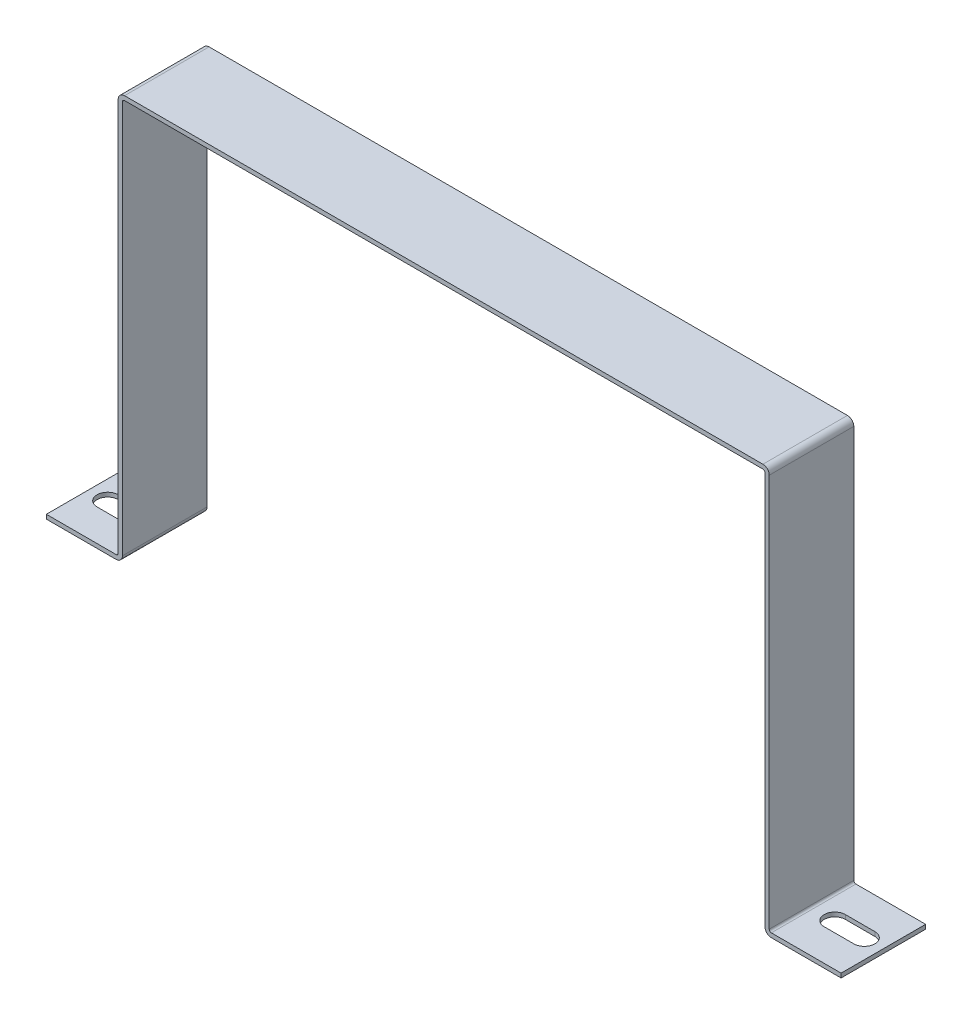
ISO-10303-21;
HEADER;
FILE_DESCRIPTION(('STEP AP214'),'2;1');
FILE_NAME('part.step','',(''),(''),'','','');
FILE_SCHEMA(('AUTOMOTIVE_DESIGN { 1 0 10303 214 1 1 1 1 }'));
ENDSEC;
DATA;
#1=APPLICATION_CONTEXT('core data for automotive mechanical design processes');
#2=APPLICATION_PROTOCOL_DEFINITION('international standard','automotive_design',2000,#1);
#3=PRODUCT_CONTEXT('',#1,'mechanical');
#4=PRODUCT('Part','Part','',(#3));
#5=PRODUCT_RELATED_PRODUCT_CATEGORY('part','',(#4));
#6=PRODUCT_DEFINITION_FORMATION('','',#4);
#7=PRODUCT_DEFINITION_CONTEXT('part definition',#1,'design');
#8=PRODUCT_DEFINITION('design','',#6,#7);
#9=PRODUCT_DEFINITION_SHAPE('','',#8);
#10=(LENGTH_UNIT() NAMED_UNIT(*) SI_UNIT(.MILLI.,.METRE.));
#11=(NAMED_UNIT(*) PLANE_ANGLE_UNIT() SI_UNIT($,.RADIAN.));
#12=(NAMED_UNIT(*) SI_UNIT($,.STERADIAN.) SOLID_ANGLE_UNIT());
#13=UNCERTAINTY_MEASURE_WITH_UNIT(LENGTH_MEASURE(1.E-05),#10,'distance_accuracy_value','');
#14=(GEOMETRIC_REPRESENTATION_CONTEXT(3) GLOBAL_UNCERTAINTY_ASSIGNED_CONTEXT((#13)) GLOBAL_UNIT_ASSIGNED_CONTEXT((#10,
#11,#12)) REPRESENTATION_CONTEXT('',''));
#15=CARTESIAN_POINT('',(0.,0.,0.));
#16=DIRECTION('',(0.,0.,1.));
#17=DIRECTION('',(1.,0.,0.));
#18=AXIS2_PLACEMENT_3D('',#15,#16,#17);
#19=CARTESIAN_POINT('',(-94.,0.999999999999997,20.));
#20=DIRECTION('',(1.,0.,0.));
#21=DIRECTION('',(0.,0.,-1.));
#22=AXIS2_PLACEMENT_3D('',#19,#20,#21);
#23=PLANE('',#22);
#24=DIRECTION('',(0.,-1.,0.));
#25=VECTOR('',#24,1.);
#26=CARTESIAN_POINT('',(-94.,0.999999999999997,0.));
#27=LINE('',#26,#25);
#28=CARTESIAN_POINT('',(-94.,0.999999999999997,0.));
#29=VERTEX_POINT('',#28);
#30=CARTESIAN_POINT('',(-94.,0.,0.));
#31=VERTEX_POINT('',#30);
#32=EDGE_CURVE('E262',#29,#31,#27,.T.);
#33=ORIENTED_EDGE('',*,*,#32,.T.);
#34=DIRECTION('',(0.,0.,-1.));
#35=VECTOR('',#34,1.);
#36=CARTESIAN_POINT('',(-94.,0.,20.));
#37=LINE('',#36,#35);
#38=CARTESIAN_POINT('',(-94.,0.,20.));
#39=VERTEX_POINT('',#38);
#40=EDGE_CURVE('E409',#39,#31,#37,.T.);
#41=ORIENTED_EDGE('',*,*,#40,.F.);
#42=DIRECTION('',(0.,-1.,0.));
#43=VECTOR('',#42,1.);
#44=CARTESIAN_POINT('',(-94.,0.999999999999997,20.));
#45=LINE('',#44,#43);
#46=CARTESIAN_POINT('',(-94.,0.999999999999997,20.));
#47=VERTEX_POINT('',#46);
#48=EDGE_CURVE('E310',#47,#39,#45,.T.);
#49=ORIENTED_EDGE('',*,*,#48,.F.);
#50=DIRECTION('',(0.,0.,-1.));
#51=VECTOR('',#50,1.);
#52=CARTESIAN_POINT('',(-94.,0.999999999999997,20.));
#53=LINE('',#52,#51);
#54=EDGE_CURVE('E351',#47,#29,#53,.T.);
#55=ORIENTED_EDGE('',*,*,#54,.T.);
#56=EDGE_LOOP('',(#33,#41,#49,#55));
#57=FACE_BOUND('',#56,.T.);
#58=ADVANCED_FACE('F36',(#57),#23,.F.);
#59=CARTESIAN_POINT('',(-77.5,0.,20.));
#60=DIRECTION('',(0.,1.,0.));
#61=DIRECTION('',(-1.,0.,0.));
#62=AXIS2_PLACEMENT_3D('',#59,#60,#61);
#63=PLANE('',#62);
#64=DIRECTION('',(1.,0.,0.));
#65=VECTOR('',#64,1.);
#66=CARTESIAN_POINT('',(-89.5,0.,7.5));
#67=LINE('',#66,#65);
#68=CARTESIAN_POINT('',(-89.5,0.,7.5));
#69=VERTEX_POINT('',#68);
#70=CARTESIAN_POINT('',(-82.5,0.,7.5));
#71=VERTEX_POINT('',#70);
#72=EDGE_CURVE('E250',#69,#71,#67,.T.);
#73=ORIENTED_EDGE('',*,*,#72,.F.);
#74=CARTESIAN_POINT('',(-89.5,0.,10.));
#75=DIRECTION('',(0.,-1.,0.));
#76=DIRECTION('',(1.,0.,0.));
#77=AXIS2_PLACEMENT_3D('',#74,#75,#76);
#78=CIRCLE('',#77,2.5);
#79=CARTESIAN_POINT('',(-89.5,0.,12.5));
#80=VERTEX_POINT('',#79);
#81=EDGE_CURVE('E246',#80,#69,#78,.T.);
#82=ORIENTED_EDGE('',*,*,#81,.F.);
#83=DIRECTION('',(-1.,0.,0.));
#84=VECTOR('',#83,1.);
#85=CARTESIAN_POINT('',(-89.5,0.,12.5));
#86=LINE('',#85,#84);
#87=CARTESIAN_POINT('',(-82.5,0.,12.5));
#88=VERTEX_POINT('',#87);
#89=EDGE_CURVE('E256',#88,#80,#86,.T.);
#90=ORIENTED_EDGE('',*,*,#89,.F.);
#91=CARTESIAN_POINT('',(-82.5,0.,10.));
#92=DIRECTION('',(0.,-1.,0.));
#93=DIRECTION('',(1.,0.,0.));
#94=AXIS2_PLACEMENT_3D('',#91,#92,#93);
#95=CIRCLE('',#94,2.5);
#96=EDGE_CURVE('E253',#71,#88,#95,.T.);
#97=ORIENTED_EDGE('',*,*,#96,.F.);
#98=EDGE_LOOP('',(#73,#82,#90,#97));
#99=FACE_BOUND('',#98,.T.);
#100=DIRECTION('',(1.,0.,0.));
#101=VECTOR('',#100,1.);
#102=CARTESIAN_POINT('',(-77.5,0.,0.));
#103=LINE('',#102,#101);
#104=CARTESIAN_POINT('',(-77.5,0.,0.));
#105=VERTEX_POINT('',#104);
#106=EDGE_CURVE('E271',#31,#105,#103,.T.);
#107=ORIENTED_EDGE('',*,*,#106,.T.);
#108=DIRECTION('',(0.,0.,-1.));
#109=VECTOR('',#108,1.);
#110=CARTESIAN_POINT('',(-77.5,0.,20.));
#111=LINE('',#110,#109);
#112=CARTESIAN_POINT('',(-77.5,0.,20.));
#113=VERTEX_POINT('',#112);
#114=EDGE_CURVE('E406',#113,#105,#111,.T.);
#115=ORIENTED_EDGE('',*,*,#114,.F.);
#116=DIRECTION('',(1.,0.,0.));
#117=VECTOR('',#116,1.);
#118=CARTESIAN_POINT('',(-77.5,0.,20.));
#119=LINE('',#118,#117);
#120=EDGE_CURVE('E313',#39,#113,#119,.T.);
#121=ORIENTED_EDGE('',*,*,#120,.F.);
#122=ORIENTED_EDGE('',*,*,#40,.T.);
#123=EDGE_LOOP('',(#107,#115,#121,#122));
#124=FACE_BOUND('',#123,.T.);
#125=ADVANCED_FACE('F448',(#99,#124),#63,.F.);
#126=CARTESIAN_POINT('',(-77.5,1.5,20.));
#127=DIRECTION('',(0.,0.,-1.));
#128=DIRECTION('',(-1.,0.,0.));
#129=AXIS2_PLACEMENT_3D('',#126,#127,#128);
#130=CYLINDRICAL_SURFACE('',#129,1.5);
#131=CARTESIAN_POINT('',(-77.5,1.5,0.));
#132=DIRECTION('',(0.,0.,1.));
#133=DIRECTION('',(-1.,0.,0.));
#134=AXIS2_PLACEMENT_3D('',#131,#132,#133);
#135=CIRCLE('',#134,1.5);
#136=CARTESIAN_POINT('',(-76.,1.50000000000001,0.));
#137=VERTEX_POINT('',#136);
#138=EDGE_CURVE('E273',#105,#137,#135,.T.);
#139=ORIENTED_EDGE('',*,*,#138,.T.);
#140=DIRECTION('',(0.,0.,-1.));
#141=VECTOR('',#140,1.);
#142=CARTESIAN_POINT('',(-76.,1.50000000000001,20.));
#143=LINE('',#142,#141);
#144=CARTESIAN_POINT('',(-76.,1.50000000000001,20.));
#145=VERTEX_POINT('',#144);
#146=EDGE_CURVE('E403',#145,#137,#143,.T.);
#147=ORIENTED_EDGE('',*,*,#146,.F.);
#148=CARTESIAN_POINT('',(-77.5,1.5,20.));
#149=DIRECTION('',(0.,0.,1.));
#150=DIRECTION('',(-1.,0.,0.));
#151=AXIS2_PLACEMENT_3D('',#148,#149,#150);
#152=CIRCLE('',#151,1.5);
#153=EDGE_CURVE('E315',#113,#145,#152,.T.);
#154=ORIENTED_EDGE('',*,*,#153,.F.);
#155=ORIENTED_EDGE('',*,*,#114,.T.);
#156=EDGE_LOOP('',(#139,#147,#154,#155));
#157=FACE_BOUND('',#156,.T.);
#158=ADVANCED_FACE('F453',(#157),#130,.T.);
#159=CARTESIAN_POINT('',(-76.,94.5,20.));
#160=DIRECTION('',(-1.,0.,0.));
#161=DIRECTION('',(0.,-1.,0.));
#162=AXIS2_PLACEMENT_3D('',#159,#160,#161);
#163=PLANE('',#162);
#164=DIRECTION('',(0.,1.,0.));
#165=VECTOR('',#164,1.);
#166=CARTESIAN_POINT('',(-76.,94.5,0.));
#167=LINE('',#166,#165);
#168=CARTESIAN_POINT('',(-76.,94.5,0.));
#169=VERTEX_POINT('',#168);
#170=EDGE_CURVE('E275',#137,#169,#167,.T.);
#171=ORIENTED_EDGE('',*,*,#170,.T.);
#172=DIRECTION('',(0.,0.,-1.));
#173=VECTOR('',#172,1.);
#174=CARTESIAN_POINT('',(-76.,94.5,20.));
#175=LINE('',#174,#173);
#176=CARTESIAN_POINT('',(-76.,94.5,20.));
#177=VERTEX_POINT('',#176);
#178=EDGE_CURVE('E400',#177,#169,#175,.T.);
#179=ORIENTED_EDGE('',*,*,#178,.F.);
#180=DIRECTION('',(0.,1.,0.));
#181=VECTOR('',#180,1.);
#182=CARTESIAN_POINT('',(-76.,94.5,20.));
#183=LINE('',#182,#181);
#184=EDGE_CURVE('E317',#145,#177,#183,.T.);
#185=ORIENTED_EDGE('',*,*,#184,.F.);
#186=ORIENTED_EDGE('',*,*,#146,.T.);
#187=EDGE_LOOP('',(#171,#179,#185,#186));
#188=FACE_BOUND('',#187,.T.);
#189=ADVANCED_FACE('F546',(#188),#163,.F.);
#190=CARTESIAN_POINT('',(-75.5,94.5,20.));
#191=DIRECTION('',(0.,0.,-1.));
#192=DIRECTION('',(-1.,0.,0.));
#193=AXIS2_PLACEMENT_3D('',#190,#191,#192);
#194=CYLINDRICAL_SURFACE('',#193,0.5);
#195=CARTESIAN_POINT('',(-75.5,94.5,0.));
#196=DIRECTION('',(0.,0.,-1.));
#197=DIRECTION('',(1.,0.,0.));
#198=AXIS2_PLACEMENT_3D('',#195,#196,#197);
#199=CIRCLE('',#198,0.5);
#200=CARTESIAN_POINT('',(-75.5,95.,0.));
#201=VERTEX_POINT('',#200);
#202=EDGE_CURVE('E278',#169,#201,#199,.T.);
#203=ORIENTED_EDGE('',*,*,#202,.T.);
#204=DIRECTION('',(0.,0.,-1.));
#205=VECTOR('',#204,1.);
#206=CARTESIAN_POINT('',(-75.5,95.,20.));
#207=LINE('',#206,#205);
#208=CARTESIAN_POINT('',(-75.5,95.,20.));
#209=VERTEX_POINT('',#208);
#210=EDGE_CURVE('E397',#209,#201,#207,.T.);
#211=ORIENTED_EDGE('',*,*,#210,.F.);
#212=CARTESIAN_POINT('',(-75.5,94.5,20.));
#213=DIRECTION('',(0.,0.,-1.));
#214=DIRECTION('',(1.,0.,0.));
#215=AXIS2_PLACEMENT_3D('',#212,#213,#214);
#216=CIRCLE('',#215,0.5);
#217=EDGE_CURVE('E319',#177,#209,#216,.T.);
#218=ORIENTED_EDGE('',*,*,#217,.F.);
#219=ORIENTED_EDGE('',*,*,#178,.T.);
#220=EDGE_LOOP('',(#203,#211,#218,#219));
#221=FACE_BOUND('',#220,.T.);
#222=ADVANCED_FACE('F542',(#221),#194,.F.);
#223=CARTESIAN_POINT('',(75.5,95.,20.));
#224=DIRECTION('',(0.,1.,0.));
#225=DIRECTION('',(0.,0.,1.));
#226=AXIS2_PLACEMENT_3D('',#223,#224,#225);
#227=PLANE('',#226);
#228=DIRECTION('',(1.,0.,0.));
#229=VECTOR('',#228,1.);
#230=CARTESIAN_POINT('',(75.5,95.,0.));
#231=LINE('',#230,#229);
#232=CARTESIAN_POINT('',(75.5,95.,0.));
#233=VERTEX_POINT('',#232);
#234=EDGE_CURVE('E280',#201,#233,#231,.T.);
#235=ORIENTED_EDGE('',*,*,#234,.T.);
#236=DIRECTION('',(0.,0.,-1.));
#237=VECTOR('',#236,1.);
#238=CARTESIAN_POINT('',(75.5,95.,20.));
#239=LINE('',#238,#237);
#240=CARTESIAN_POINT('',(75.5,95.,20.));
#241=VERTEX_POINT('',#240);
#242=EDGE_CURVE('E394',#241,#233,#239,.T.);
#243=ORIENTED_EDGE('',*,*,#242,.F.);
#244=DIRECTION('',(1.,0.,0.));
#245=VECTOR('',#244,1.);
#246=CARTESIAN_POINT('',(75.5,95.,20.));
#247=LINE('',#246,#245);
#248=EDGE_CURVE('E321',#209,#241,#247,.T.);
#249=ORIENTED_EDGE('',*,*,#248,.F.);
#250=ORIENTED_EDGE('',*,*,#210,.T.);
#251=EDGE_LOOP('',(#235,#243,#249,#250));
#252=FACE_BOUND('',#251,.T.);
#253=ADVANCED_FACE('F537',(#252),#227,.F.);
#254=CARTESIAN_POINT('',(75.5,94.5,20.));
#255=DIRECTION('',(0.,0.,-1.));
#256=DIRECTION('',(-1.,0.,0.));
#257=AXIS2_PLACEMENT_3D('',#254,#255,#256);
#258=CYLINDRICAL_SURFACE('',#257,0.499999999999987);
#259=CARTESIAN_POINT('',(75.5,94.5,0.));
#260=DIRECTION('',(0.,0.,-1.));
#261=DIRECTION('',(-1.,0.,0.));
#262=AXIS2_PLACEMENT_3D('',#259,#260,#261);
#263=CIRCLE('',#262,0.499999999999987);
#264=CARTESIAN_POINT('',(76.,94.5,0.));
#265=VERTEX_POINT('',#264);
#266=EDGE_CURVE('E282',#233,#265,#263,.T.);
#267=ORIENTED_EDGE('',*,*,#266,.T.);
#268=DIRECTION('',(0.,0.,-1.));
#269=VECTOR('',#268,1.);
#270=CARTESIAN_POINT('',(76.,94.5,20.));
#271=LINE('',#270,#269);
#272=CARTESIAN_POINT('',(76.,94.5,20.));
#273=VERTEX_POINT('',#272);
#274=EDGE_CURVE('E391',#273,#265,#271,.T.);
#275=ORIENTED_EDGE('',*,*,#274,.F.);
#276=CARTESIAN_POINT('',(75.5,94.5,20.));
#277=DIRECTION('',(0.,0.,-1.));
#278=DIRECTION('',(-1.,0.,0.));
#279=AXIS2_PLACEMENT_3D('',#276,#277,#278);
#280=CIRCLE('',#279,0.499999999999987);
#281=EDGE_CURVE('E323',#241,#273,#280,.T.);
#282=ORIENTED_EDGE('',*,*,#281,.F.);
#283=ORIENTED_EDGE('',*,*,#242,.T.);
#284=EDGE_LOOP('',(#267,#275,#282,#283));
#285=FACE_BOUND('',#284,.T.);
#286=ADVANCED_FACE('F532',(#285),#258,.F.);
#287=CARTESIAN_POINT('',(76.,94.5,20.));
#288=DIRECTION('',(1.,0.,0.));
#289=DIRECTION('',(0.,1.,0.));
#290=AXIS2_PLACEMENT_3D('',#287,#288,#289);
#291=PLANE('',#290);
#292=DIRECTION('',(0.,-1.,0.));
#293=VECTOR('',#292,1.);
#294=CARTESIAN_POINT('',(76.,94.5,0.));
#295=LINE('',#294,#293);
#296=CARTESIAN_POINT('',(76.,1.50000000000001,0.));
#297=VERTEX_POINT('',#296);
#298=EDGE_CURVE('E284',#265,#297,#295,.T.);
#299=ORIENTED_EDGE('',*,*,#298,.T.);
#300=DIRECTION('',(0.,0.,-1.));
#301=VECTOR('',#300,1.);
#302=CARTESIAN_POINT('',(76.,1.50000000000001,20.));
#303=LINE('',#302,#301);
#304=CARTESIAN_POINT('',(76.,1.50000000000001,20.));
#305=VERTEX_POINT('',#304);
#306=EDGE_CURVE('E388',#305,#297,#303,.T.);
#307=ORIENTED_EDGE('',*,*,#306,.F.);
#308=DIRECTION('',(0.,-1.,0.));
#309=VECTOR('',#308,1.);
#310=CARTESIAN_POINT('',(76.,94.5,20.));
#311=LINE('',#310,#309);
#312=EDGE_CURVE('E325',#273,#305,#311,.T.);
#313=ORIENTED_EDGE('',*,*,#312,.F.);
#314=ORIENTED_EDGE('',*,*,#274,.T.);
#315=EDGE_LOOP('',(#299,#307,#313,#314));
#316=FACE_BOUND('',#315,.T.);
#317=ADVANCED_FACE('F528',(#316),#291,.F.);
#318=CARTESIAN_POINT('',(77.5,1.5,20.));
#319=DIRECTION('',(0.,0.,-1.));
#320=DIRECTION('',(-1.,0.,0.));
#321=AXIS2_PLACEMENT_3D('',#318,#319,#320);
#322=CYLINDRICAL_SURFACE('',#321,1.5);
#323=CARTESIAN_POINT('',(77.5,1.5,0.));
#324=DIRECTION('',(0.,0.,1.));
#325=DIRECTION('',(1.,0.,0.));
#326=AXIS2_PLACEMENT_3D('',#323,#324,#325);
#327=CIRCLE('',#326,1.5);
#328=CARTESIAN_POINT('',(77.5,0.,0.));
#329=VERTEX_POINT('',#328);
#330=EDGE_CURVE('E286',#297,#329,#327,.T.);
#331=ORIENTED_EDGE('',*,*,#330,.T.);
#332=DIRECTION('',(0.,0.,-1.));
#333=VECTOR('',#332,1.);
#334=CARTESIAN_POINT('',(77.5,0.,20.));
#335=LINE('',#334,#333);
#336=CARTESIAN_POINT('',(77.5,0.,20.));
#337=VERTEX_POINT('',#336);
#338=EDGE_CURVE('E385',#337,#329,#335,.T.);
#339=ORIENTED_EDGE('',*,*,#338,.F.);
#340=CARTESIAN_POINT('',(77.5,1.5,20.));
#341=DIRECTION('',(0.,0.,1.));
#342=DIRECTION('',(1.,0.,0.));
#343=AXIS2_PLACEMENT_3D('',#340,#341,#342);
#344=CIRCLE('',#343,1.5);
#345=EDGE_CURVE('E327',#305,#337,#344,.T.);
#346=ORIENTED_EDGE('',*,*,#345,.F.);
#347=ORIENTED_EDGE('',*,*,#306,.T.);
#348=EDGE_LOOP('',(#331,#339,#346,#347));
#349=FACE_BOUND('',#348,.T.);
#350=ADVANCED_FACE('F523',(#349),#322,.T.);
#351=CARTESIAN_POINT('',(77.5,0.,20.));
#352=DIRECTION('',(0.,1.,0.));
#353=DIRECTION('',(-1.,0.,0.));
#354=AXIS2_PLACEMENT_3D('',#351,#352,#353);
#355=PLANE('',#354);
#356=DIRECTION('',(1.,0.,0.));
#357=VECTOR('',#356,1.);
#358=CARTESIAN_POINT('',(89.5,0.,7.5));
#359=LINE('',#358,#357);
#360=CARTESIAN_POINT('',(82.5,0.,7.5));
#361=VERTEX_POINT('',#360);
#362=CARTESIAN_POINT('',(89.5,0.,7.5));
#363=VERTEX_POINT('',#362);
#364=EDGE_CURVE('E232',#361,#363,#359,.T.);
#365=ORIENTED_EDGE('',*,*,#364,.F.);
#366=CARTESIAN_POINT('',(82.5,0.,10.));
#367=DIRECTION('',(0.,-1.,0.));
#368=DIRECTION('',(-1.,0.,0.));
#369=AXIS2_PLACEMENT_3D('',#366,#367,#368);
#370=CIRCLE('',#369,2.5);
#371=CARTESIAN_POINT('',(82.5,0.,12.5));
#372=VERTEX_POINT('',#371);
#373=EDGE_CURVE('E50',#372,#361,#370,.T.);
#374=ORIENTED_EDGE('',*,*,#373,.F.);
#375=DIRECTION('',(-1.,0.,0.));
#376=VECTOR('',#375,1.);
#377=CARTESIAN_POINT('',(89.5,0.,12.5));
#378=LINE('',#377,#376);
#379=CARTESIAN_POINT('',(89.5,0.,12.5));
#380=VERTEX_POINT('',#379);
#381=EDGE_CURVE('E239',#380,#372,#378,.T.);
#382=ORIENTED_EDGE('',*,*,#381,.F.);
#383=CARTESIAN_POINT('',(89.5,0.,10.));
#384=DIRECTION('',(0.,-1.,0.));
#385=DIRECTION('',(-1.,0.,0.));
#386=AXIS2_PLACEMENT_3D('',#383,#384,#385);
#387=CIRCLE('',#386,2.5);
#388=EDGE_CURVE('E223',#363,#380,#387,.T.);
#389=ORIENTED_EDGE('',*,*,#388,.F.);
#390=EDGE_LOOP('',(#365,#374,#382,#389));
#391=FACE_BOUND('',#390,.T.);
#392=DIRECTION('',(1.,0.,0.));
#393=VECTOR('',#392,1.);
#394=CARTESIAN_POINT('',(77.5,0.,0.));
#395=LINE('',#394,#393);
#396=CARTESIAN_POINT('',(94.,0.,0.));
#397=VERTEX_POINT('',#396);
#398=EDGE_CURVE('E288',#329,#397,#395,.T.);
#399=ORIENTED_EDGE('',*,*,#398,.T.);
#400=DIRECTION('',(0.,0.,-1.));
#401=VECTOR('',#400,1.);
#402=CARTESIAN_POINT('',(94.,0.,20.));
#403=LINE('',#402,#401);
#404=CARTESIAN_POINT('',(94.,0.,20.));
#405=VERTEX_POINT('',#404);
#406=EDGE_CURVE('E382',#405,#397,#403,.T.);
#407=ORIENTED_EDGE('',*,*,#406,.F.);
#408=DIRECTION('',(1.,0.,0.));
#409=VECTOR('',#408,1.);
#410=CARTESIAN_POINT('',(77.5,0.,20.));
#411=LINE('',#410,#409);
#412=EDGE_CURVE('E329',#337,#405,#411,.T.);
#413=ORIENTED_EDGE('',*,*,#412,.F.);
#414=ORIENTED_EDGE('',*,*,#338,.T.);
#415=EDGE_LOOP('',(#399,#407,#413,#414));
#416=FACE_BOUND('',#415,.T.);
#417=ADVANCED_FACE('F236',(#391,#416),#355,.F.);
#418=CARTESIAN_POINT('',(94.,0.999999999999997,20.));
#419=DIRECTION('',(-1.,0.,0.));
#420=DIRECTION('',(0.,0.,1.));
#421=AXIS2_PLACEMENT_3D('',#418,#419,#420);
#422=PLANE('',#421);
#423=DIRECTION('',(0.,1.,0.));
#424=VECTOR('',#423,1.);
#425=CARTESIAN_POINT('',(94.,0.999999999999997,0.));
#426=LINE('',#425,#424);
#427=CARTESIAN_POINT('',(94.,0.999999999999997,0.));
#428=VERTEX_POINT('',#427);
#429=EDGE_CURVE('E290',#397,#428,#426,.T.);
#430=ORIENTED_EDGE('',*,*,#429,.T.);
#431=DIRECTION('',(0.,0.,-1.));
#432=VECTOR('',#431,1.);
#433=CARTESIAN_POINT('',(94.,0.999999999999997,20.));
#434=LINE('',#433,#432);
#435=CARTESIAN_POINT('',(94.,0.999999999999997,20.));
#436=VERTEX_POINT('',#435);
#437=EDGE_CURVE('E379',#436,#428,#434,.T.);
#438=ORIENTED_EDGE('',*,*,#437,.F.);
#439=DIRECTION('',(0.,1.,0.));
#440=VECTOR('',#439,1.);
#441=CARTESIAN_POINT('',(94.,0.999999999999997,20.));
#442=LINE('',#441,#440);
#443=EDGE_CURVE('E331',#405,#436,#442,.T.);
#444=ORIENTED_EDGE('',*,*,#443,.F.);
#445=ORIENTED_EDGE('',*,*,#406,.T.);
#446=EDGE_LOOP('',(#430,#438,#444,#445));
#447=FACE_BOUND('',#446,.T.);
#448=ADVANCED_FACE('F515',(#447),#422,.F.);
#449=CARTESIAN_POINT('',(77.5,0.999999999999997,20.));
#450=DIRECTION('',(0.,-1.,0.));
#451=DIRECTION('',(0.,0.,-1.));
#452=AXIS2_PLACEMENT_3D('',#449,#450,#451);
#453=PLANE('',#452);
#454=DIRECTION('',(-1.,0.,0.));
#455=VECTOR('',#454,1.);
#456=CARTESIAN_POINT('',(77.5,0.999999999999997,12.5));
#457=LINE('',#456,#455);
#458=CARTESIAN_POINT('',(89.5,1.00000000000003,12.5));
#459=VERTEX_POINT('',#458);
#460=CARTESIAN_POINT('',(82.5,1.00000000000003,12.5));
#461=VERTEX_POINT('',#460);
#462=EDGE_CURVE('E43',#459,#461,#457,.T.);
#463=ORIENTED_EDGE('',*,*,#462,.T.);
#464=CARTESIAN_POINT('',(82.5,1.,10.));
#465=DIRECTION('',(0.,-1.,0.));
#466=DIRECTION('',(0.,0.,-1.));
#467=AXIS2_PLACEMENT_3D('',#464,#465,#466);
#468=CIRCLE('',#467,2.5);
#469=CARTESIAN_POINT('',(82.5,1.00000000000003,7.5));
#470=VERTEX_POINT('',#469);
#471=EDGE_CURVE('E11',#461,#470,#468,.T.);
#472=ORIENTED_EDGE('',*,*,#471,.T.);
#473=DIRECTION('',(1.,0.,0.));
#474=VECTOR('',#473,1.);
#475=CARTESIAN_POINT('',(77.5,0.999999999999997,7.5));
#476=LINE('',#475,#474);
#477=CARTESIAN_POINT('',(89.5,0.999999999999997,7.5));
#478=VERTEX_POINT('',#477);
#479=EDGE_CURVE('E424',#470,#478,#476,.T.);
#480=ORIENTED_EDGE('',*,*,#479,.T.);
#481=CARTESIAN_POINT('',(89.5,1.,10.));
#482=DIRECTION('',(0.,-1.,0.));
#483=DIRECTION('',(0.,0.,-1.));
#484=AXIS2_PLACEMENT_3D('',#481,#482,#483);
#485=CIRCLE('',#484,2.5);
#486=EDGE_CURVE('E226',#478,#459,#485,.T.);
#487=ORIENTED_EDGE('',*,*,#486,.T.);
#488=EDGE_LOOP('',(#463,#472,#480,#487));
#489=FACE_BOUND('',#488,.T.);
#490=DIRECTION('',(-1.,0.,0.));
#491=VECTOR('',#490,1.);
#492=CARTESIAN_POINT('',(77.5,0.999999999999997,0.));
#493=LINE('',#492,#491);
#494=CARTESIAN_POINT('',(77.5,0.999999999999997,0.));
#495=VERTEX_POINT('',#494);
#496=EDGE_CURVE('E292',#428,#495,#493,.T.);
#497=ORIENTED_EDGE('',*,*,#496,.T.);
#498=DIRECTION('',(0.,0.,-1.));
#499=VECTOR('',#498,1.);
#500=CARTESIAN_POINT('',(77.5,0.999999999999997,20.));
#501=LINE('',#500,#499);
#502=CARTESIAN_POINT('',(77.5,0.999999999999997,20.));
#503=VERTEX_POINT('',#502);
#504=EDGE_CURVE('E376',#503,#495,#501,.T.);
#505=ORIENTED_EDGE('',*,*,#504,.F.);
#506=DIRECTION('',(-1.,0.,0.));
#507=VECTOR('',#506,1.);
#508=CARTESIAN_POINT('',(77.5,0.999999999999997,20.));
#509=LINE('',#508,#507);
#510=EDGE_CURVE('E333',#436,#503,#509,.T.);
#511=ORIENTED_EDGE('',*,*,#510,.F.);
#512=ORIENTED_EDGE('',*,*,#437,.T.);
#513=EDGE_LOOP('',(#497,#505,#511,#512));
#514=FACE_BOUND('',#513,.T.);
#515=ADVANCED_FACE('F428',(#489,#514),#453,.F.);
#516=CARTESIAN_POINT('',(77.5,1.5,20.));
#517=DIRECTION('',(0.,0.,-1.));
#518=DIRECTION('',(-1.,0.,0.));
#519=AXIS2_PLACEMENT_3D('',#516,#517,#518);
#520=CYLINDRICAL_SURFACE('',#519,0.499999999999993);
#521=CARTESIAN_POINT('',(77.5,1.5,0.));
#522=DIRECTION('',(0.,0.,-1.));
#523=DIRECTION('',(1.,0.,0.));
#524=AXIS2_PLACEMENT_3D('',#521,#522,#523);
#525=CIRCLE('',#524,0.499999999999993);
#526=CARTESIAN_POINT('',(77.,1.5,0.));
#527=VERTEX_POINT('',#526);
#528=EDGE_CURVE('E294',#495,#527,#525,.T.);
#529=ORIENTED_EDGE('',*,*,#528,.T.);
#530=DIRECTION('',(0.,0.,-1.));
#531=VECTOR('',#530,1.);
#532=CARTESIAN_POINT('',(77.,1.5,20.));
#533=LINE('',#532,#531);
#534=CARTESIAN_POINT('',(77.,1.5,20.));
#535=VERTEX_POINT('',#534);
#536=EDGE_CURVE('E373',#535,#527,#533,.T.);
#537=ORIENTED_EDGE('',*,*,#536,.F.);
#538=CARTESIAN_POINT('',(77.5,1.5,20.));
#539=DIRECTION('',(0.,0.,-1.));
#540=DIRECTION('',(1.,0.,0.));
#541=AXIS2_PLACEMENT_3D('',#538,#539,#540);
#542=CIRCLE('',#541,0.499999999999993);
#543=EDGE_CURVE('E335',#503,#535,#542,.T.);
#544=ORIENTED_EDGE('',*,*,#543,.F.);
#545=ORIENTED_EDGE('',*,*,#504,.T.);
#546=EDGE_LOOP('',(#529,#537,#544,#545));
#547=FACE_BOUND('',#546,.T.);
#548=ADVANCED_FACE('F506',(#547),#520,.F.);
#549=CARTESIAN_POINT('',(77.,94.5,20.));
#550=DIRECTION('',(-1.,0.,0.));
#551=DIRECTION('',(0.,0.,1.));
#552=AXIS2_PLACEMENT_3D('',#549,#550,#551);
#553=PLANE('',#552);
#554=DIRECTION('',(0.,1.,0.));
#555=VECTOR('',#554,1.);
#556=CARTESIAN_POINT('',(77.,94.5,0.));
#557=LINE('',#556,#555);
#558=CARTESIAN_POINT('',(77.,94.5,0.));
#559=VERTEX_POINT('',#558);
#560=EDGE_CURVE('E296',#527,#559,#557,.T.);
#561=ORIENTED_EDGE('',*,*,#560,.T.);
#562=DIRECTION('',(0.,0.,-1.));
#563=VECTOR('',#562,1.);
#564=CARTESIAN_POINT('',(77.,94.5,20.));
#565=LINE('',#564,#563);
#566=CARTESIAN_POINT('',(77.,94.5,20.));
#567=VERTEX_POINT('',#566);
#568=EDGE_CURVE('E370',#567,#559,#565,.T.);
#569=ORIENTED_EDGE('',*,*,#568,.F.);
#570=DIRECTION('',(0.,1.,0.));
#571=VECTOR('',#570,1.);
#572=CARTESIAN_POINT('',(77.,94.5,20.));
#573=LINE('',#572,#571);
#574=EDGE_CURVE('E337',#535,#567,#573,.T.);
#575=ORIENTED_EDGE('',*,*,#574,.F.);
#576=ORIENTED_EDGE('',*,*,#536,.T.);
#577=EDGE_LOOP('',(#561,#569,#575,#576));
#578=FACE_BOUND('',#577,.T.);
#579=ADVANCED_FACE('F502',(#578),#553,.F.);
#580=CARTESIAN_POINT('',(75.5,94.5,20.));
#581=DIRECTION('',(0.,0.,-1.));
#582=DIRECTION('',(-1.,0.,0.));
#583=AXIS2_PLACEMENT_3D('',#580,#581,#582);
#584=CYLINDRICAL_SURFACE('',#583,1.5);
#585=CARTESIAN_POINT('',(75.5,94.5,0.));
#586=DIRECTION('',(0.,0.,1.));
#587=DIRECTION('',(-1.,0.,0.));
#588=AXIS2_PLACEMENT_3D('',#585,#586,#587);
#589=CIRCLE('',#588,1.5);
#590=CARTESIAN_POINT('',(75.5,96.,0.));
#591=VERTEX_POINT('',#590);
#592=EDGE_CURVE('E298',#559,#591,#589,.T.);
#593=ORIENTED_EDGE('',*,*,#592,.T.);
#594=DIRECTION('',(0.,0.,-1.));
#595=VECTOR('',#594,1.);
#596=CARTESIAN_POINT('',(75.5,96.,20.));
#597=LINE('',#596,#595);
#598=CARTESIAN_POINT('',(75.5,96.,20.));
#599=VERTEX_POINT('',#598);
#600=EDGE_CURVE('E367',#599,#591,#597,.T.);
#601=ORIENTED_EDGE('',*,*,#600,.F.);
#602=CARTESIAN_POINT('',(75.5,94.5,20.));
#603=DIRECTION('',(0.,0.,1.));
#604=DIRECTION('',(-1.,0.,0.));
#605=AXIS2_PLACEMENT_3D('',#602,#603,#604);
#606=CIRCLE('',#605,1.5);
#607=EDGE_CURVE('E339',#567,#599,#606,.T.);
#608=ORIENTED_EDGE('',*,*,#607,.F.);
#609=ORIENTED_EDGE('',*,*,#568,.T.);
#610=EDGE_LOOP('',(#593,#601,#608,#609));
#611=FACE_BOUND('',#610,.T.);
#612=ADVANCED_FACE('F497',(#611),#584,.T.);
#613=CARTESIAN_POINT('',(75.5,96.,20.));
#614=DIRECTION('',(0.,-1.,0.));
#615=DIRECTION('',(0.,0.,-1.));
#616=AXIS2_PLACEMENT_3D('',#613,#614,#615);
#617=PLANE('',#616);
#618=DIRECTION('',(-1.,0.,0.));
#619=VECTOR('',#618,1.);
#620=CARTESIAN_POINT('',(75.5,96.,0.));
#621=LINE('',#620,#619);
#622=CARTESIAN_POINT('',(-75.5,96.,0.));
#623=VERTEX_POINT('',#622);
#624=EDGE_CURVE('E300',#591,#623,#621,.T.);
#625=ORIENTED_EDGE('',*,*,#624,.T.);
#626=DIRECTION('',(0.,0.,-1.));
#627=VECTOR('',#626,1.);
#628=CARTESIAN_POINT('',(-75.5,96.,20.));
#629=LINE('',#628,#627);
#630=CARTESIAN_POINT('',(-75.5,96.,20.));
#631=VERTEX_POINT('',#630);
#632=EDGE_CURVE('E364',#631,#623,#629,.T.);
#633=ORIENTED_EDGE('',*,*,#632,.F.);
#634=DIRECTION('',(-1.,0.,0.));
#635=VECTOR('',#634,1.);
#636=CARTESIAN_POINT('',(75.5,96.,20.));
#637=LINE('',#636,#635);
#638=EDGE_CURVE('E341',#599,#631,#637,.T.);
#639=ORIENTED_EDGE('',*,*,#638,.F.);
#640=ORIENTED_EDGE('',*,*,#600,.T.);
#641=EDGE_LOOP('',(#625,#633,#639,#640));
#642=FACE_BOUND('',#641,.T.);
#643=ADVANCED_FACE('F491',(#642),#617,.F.);
#644=CARTESIAN_POINT('',(-75.5,94.5,20.));
#645=DIRECTION('',(0.,0.,-1.));
#646=DIRECTION('',(-1.,0.,0.));
#647=AXIS2_PLACEMENT_3D('',#644,#645,#646);
#648=CYLINDRICAL_SURFACE('',#647,1.5);
#649=CARTESIAN_POINT('',(-75.5,94.5,0.));
#650=DIRECTION('',(0.,0.,1.));
#651=DIRECTION('',(1.,0.,0.));
#652=AXIS2_PLACEMENT_3D('',#649,#650,#651);
#653=CIRCLE('',#652,1.5);
#654=CARTESIAN_POINT('',(-77.,94.5,0.));
#655=VERTEX_POINT('',#654);
#656=EDGE_CURVE('E302',#623,#655,#653,.T.);
#657=ORIENTED_EDGE('',*,*,#656,.T.);
#658=DIRECTION('',(0.,0.,-1.));
#659=VECTOR('',#658,1.);
#660=CARTESIAN_POINT('',(-77.,94.5,20.));
#661=LINE('',#660,#659);
#662=CARTESIAN_POINT('',(-77.,94.5,20.));
#663=VERTEX_POINT('',#662);
#664=EDGE_CURVE('E361',#663,#655,#661,.T.);
#665=ORIENTED_EDGE('',*,*,#664,.F.);
#666=CARTESIAN_POINT('',(-75.5,94.5,20.));
#667=DIRECTION('',(0.,0.,1.));
#668=DIRECTION('',(1.,0.,0.));
#669=AXIS2_PLACEMENT_3D('',#666,#667,#668);
#670=CIRCLE('',#669,1.5);
#671=EDGE_CURVE('E343',#631,#663,#670,.T.);
#672=ORIENTED_EDGE('',*,*,#671,.F.);
#673=ORIENTED_EDGE('',*,*,#632,.T.);
#674=EDGE_LOOP('',(#657,#665,#672,#673));
#675=FACE_BOUND('',#674,.T.);
#676=ADVANCED_FACE('F487',(#675),#648,.T.);
#677=CARTESIAN_POINT('',(-77.,94.5,20.));
#678=DIRECTION('',(1.,0.,0.));
#679=DIRECTION('',(0.,0.,-1.));
#680=AXIS2_PLACEMENT_3D('',#677,#678,#679);
#681=PLANE('',#680);
#682=DIRECTION('',(0.,-1.,0.));
#683=VECTOR('',#682,1.);
#684=CARTESIAN_POINT('',(-77.,94.5,0.));
#685=LINE('',#684,#683);
#686=CARTESIAN_POINT('',(-77.,1.5,0.));
#687=VERTEX_POINT('',#686);
#688=EDGE_CURVE('E304',#655,#687,#685,.T.);
#689=ORIENTED_EDGE('',*,*,#688,.T.);
#690=DIRECTION('',(0.,0.,-1.));
#691=VECTOR('',#690,1.);
#692=CARTESIAN_POINT('',(-77.,1.5,20.));
#693=LINE('',#692,#691);
#694=CARTESIAN_POINT('',(-77.,1.5,20.));
#695=VERTEX_POINT('',#694);
#696=EDGE_CURVE('E358',#695,#687,#693,.T.);
#697=ORIENTED_EDGE('',*,*,#696,.F.);
#698=DIRECTION('',(0.,-1.,0.));
#699=VECTOR('',#698,1.);
#700=CARTESIAN_POINT('',(-77.,94.5,20.));
#701=LINE('',#700,#699);
#702=EDGE_CURVE('E345',#663,#695,#701,.T.);
#703=ORIENTED_EDGE('',*,*,#702,.F.);
#704=ORIENTED_EDGE('',*,*,#664,.T.);
#705=EDGE_LOOP('',(#689,#697,#703,#704));
#706=FACE_BOUND('',#705,.T.);
#707=ADVANCED_FACE('F482',(#706),#681,.F.);
#708=CARTESIAN_POINT('',(-77.5,1.5,20.));
#709=DIRECTION('',(0.,0.,-1.));
#710=DIRECTION('',(-1.,0.,0.));
#711=AXIS2_PLACEMENT_3D('',#708,#709,#710);
#712=CYLINDRICAL_SURFACE('',#711,0.5);
#713=CARTESIAN_POINT('',(-77.5,1.5,0.));
#714=DIRECTION('',(0.,0.,-1.));
#715=DIRECTION('',(-1.,0.,0.));
#716=AXIS2_PLACEMENT_3D('',#713,#714,#715);
#717=CIRCLE('',#716,0.5);
#718=CARTESIAN_POINT('',(-77.5,0.999999999999997,0.));
#719=VERTEX_POINT('',#718);
#720=EDGE_CURVE('E306',#687,#719,#717,.T.);
#721=ORIENTED_EDGE('',*,*,#720,.T.);
#722=DIRECTION('',(0.,0.,-1.));
#723=VECTOR('',#722,1.);
#724=CARTESIAN_POINT('',(-77.5,0.999999999999997,20.));
#725=LINE('',#724,#723);
#726=CARTESIAN_POINT('',(-77.5,0.999999999999997,20.));
#727=VERTEX_POINT('',#726);
#728=EDGE_CURVE('E355',#727,#719,#725,.T.);
#729=ORIENTED_EDGE('',*,*,#728,.F.);
#730=CARTESIAN_POINT('',(-77.5,1.5,20.));
#731=DIRECTION('',(0.,0.,-1.));
#732=DIRECTION('',(-1.,0.,0.));
#733=AXIS2_PLACEMENT_3D('',#730,#731,#732);
#734=CIRCLE('',#733,0.5);
#735=EDGE_CURVE('E347',#695,#727,#734,.T.);
#736=ORIENTED_EDGE('',*,*,#735,.F.);
#737=ORIENTED_EDGE('',*,*,#696,.T.);
#738=EDGE_LOOP('',(#721,#729,#736,#737));
#739=FACE_BOUND('',#738,.T.);
#740=ADVANCED_FACE('F476',(#739),#712,.F.);
#741=CARTESIAN_POINT('',(-77.5,0.999999999999997,20.));
#742=DIRECTION('',(0.,-1.,0.));
#743=DIRECTION('',(0.,0.,-1.));
#744=AXIS2_PLACEMENT_3D('',#741,#742,#743);
#745=PLANE('',#744);
#746=DIRECTION('',(-1.,0.,0.));
#747=VECTOR('',#746,1.);
#748=CARTESIAN_POINT('',(-77.5,0.999999999999997,12.5));
#749=LINE('',#748,#747);
#750=CARTESIAN_POINT('',(-82.5,1.00000000000003,12.5));
#751=VERTEX_POINT('',#750);
#752=CARTESIAN_POINT('',(-89.5,1.00000000000003,12.5));
#753=VERTEX_POINT('',#752);
#754=EDGE_CURVE('E418',#751,#753,#749,.T.);
#755=ORIENTED_EDGE('',*,*,#754,.T.);
#756=CARTESIAN_POINT('',(-89.5,1.,10.));
#757=DIRECTION('',(0.,-1.,0.));
#758=DIRECTION('',(0.,0.,-1.));
#759=AXIS2_PLACEMENT_3D('',#756,#757,#758);
#760=CIRCLE('',#759,2.5);
#761=CARTESIAN_POINT('',(-89.5,1.00000000000003,7.5));
#762=VERTEX_POINT('',#761);
#763=EDGE_CURVE('E421',#753,#762,#760,.T.);
#764=ORIENTED_EDGE('',*,*,#763,.T.);
#765=DIRECTION('',(1.,0.,0.));
#766=VECTOR('',#765,1.);
#767=CARTESIAN_POINT('',(-77.5,0.999999999999997,7.5));
#768=LINE('',#767,#766);
#769=CARTESIAN_POINT('',(-82.5,0.999999999999997,7.5));
#770=VERTEX_POINT('',#769);
#771=EDGE_CURVE('E412',#762,#770,#768,.T.);
#772=ORIENTED_EDGE('',*,*,#771,.T.);
#773=CARTESIAN_POINT('',(-82.5,1.,10.));
#774=DIRECTION('',(0.,-1.,0.));
#775=DIRECTION('',(0.,0.,-1.));
#776=AXIS2_PLACEMENT_3D('',#773,#774,#775);
#777=CIRCLE('',#776,2.5);
#778=EDGE_CURVE('E415',#770,#751,#777,.T.);
#779=ORIENTED_EDGE('',*,*,#778,.T.);
#780=EDGE_LOOP('',(#755,#764,#772,#779));
#781=FACE_BOUND('',#780,.T.);
#782=DIRECTION('',(-1.,0.,0.));
#783=VECTOR('',#782,1.);
#784=CARTESIAN_POINT('',(-77.5,0.999999999999997,0.));
#785=LINE('',#784,#783);
#786=EDGE_CURVE('E308',#719,#29,#785,.T.);
#787=ORIENTED_EDGE('',*,*,#786,.T.);
#788=ORIENTED_EDGE('',*,*,#54,.F.);
#789=DIRECTION('',(-1.,0.,0.));
#790=VECTOR('',#789,1.);
#791=CARTESIAN_POINT('',(-77.5,0.999999999999997,20.));
#792=LINE('',#791,#790);
#793=EDGE_CURVE('E349',#727,#47,#792,.T.);
#794=ORIENTED_EDGE('',*,*,#793,.F.);
#795=ORIENTED_EDGE('',*,*,#728,.T.);
#796=EDGE_LOOP('',(#787,#788,#794,#795));
#797=FACE_BOUND('',#796,.T.);
#798=ADVANCED_FACE('F474',(#781,#797),#745,.F.);
#799=CARTESIAN_POINT('',(-77.5,1.5,20.));
#800=DIRECTION('',(0.,0.,-1.));
#801=DIRECTION('',(-1.,0.,0.));
#802=AXIS2_PLACEMENT_3D('',#799,#800,#801);
#803=PLANE('',#802);
#804=ORIENTED_EDGE('',*,*,#48,.T.);
#805=ORIENTED_EDGE('',*,*,#120,.T.);
#806=ORIENTED_EDGE('',*,*,#153,.T.);
#807=ORIENTED_EDGE('',*,*,#184,.T.);
#808=ORIENTED_EDGE('',*,*,#217,.T.);
#809=ORIENTED_EDGE('',*,*,#248,.T.);
#810=ORIENTED_EDGE('',*,*,#281,.T.);
#811=ORIENTED_EDGE('',*,*,#312,.T.);
#812=ORIENTED_EDGE('',*,*,#345,.T.);
#813=ORIENTED_EDGE('',*,*,#412,.T.);
#814=ORIENTED_EDGE('',*,*,#443,.T.);
#815=ORIENTED_EDGE('',*,*,#510,.T.);
#816=ORIENTED_EDGE('',*,*,#543,.T.);
#817=ORIENTED_EDGE('',*,*,#574,.T.);
#818=ORIENTED_EDGE('',*,*,#607,.T.);
#819=ORIENTED_EDGE('',*,*,#638,.T.);
#820=ORIENTED_EDGE('',*,*,#671,.T.);
#821=ORIENTED_EDGE('',*,*,#702,.T.);
#822=ORIENTED_EDGE('',*,*,#735,.T.);
#823=ORIENTED_EDGE('',*,*,#793,.T.);
#824=EDGE_LOOP('',(#804,#805,#806,#807,#808,#809,#810,#811,#812,#813,#814,#815,#816,#817,#818,
#819,#820,#821,#822,#823));
#825=FACE_BOUND('',#824,.T.);
#826=ADVANCED_FACE('F469',(#825),#803,.F.);
#827=CARTESIAN_POINT('',(-77.5,1.5,0.));
#828=DIRECTION('',(0.,0.,-1.));
#829=DIRECTION('',(-1.,0.,0.));
#830=AXIS2_PLACEMENT_3D('',#827,#828,#829);
#831=PLANE('',#830);
#832=ORIENTED_EDGE('',*,*,#32,.F.);
#833=ORIENTED_EDGE('',*,*,#786,.F.);
#834=ORIENTED_EDGE('',*,*,#720,.F.);
#835=ORIENTED_EDGE('',*,*,#688,.F.);
#836=ORIENTED_EDGE('',*,*,#656,.F.);
#837=ORIENTED_EDGE('',*,*,#624,.F.);
#838=ORIENTED_EDGE('',*,*,#592,.F.);
#839=ORIENTED_EDGE('',*,*,#560,.F.);
#840=ORIENTED_EDGE('',*,*,#528,.F.);
#841=ORIENTED_EDGE('',*,*,#496,.F.);
#842=ORIENTED_EDGE('',*,*,#429,.F.);
#843=ORIENTED_EDGE('',*,*,#398,.F.);
#844=ORIENTED_EDGE('',*,*,#330,.F.);
#845=ORIENTED_EDGE('',*,*,#298,.F.);
#846=ORIENTED_EDGE('',*,*,#266,.F.);
#847=ORIENTED_EDGE('',*,*,#234,.F.);
#848=ORIENTED_EDGE('',*,*,#202,.F.);
#849=ORIENTED_EDGE('',*,*,#170,.F.);
#850=ORIENTED_EDGE('',*,*,#138,.F.);
#851=ORIENTED_EDGE('',*,*,#106,.F.);
#852=EDGE_LOOP('',(#832,#833,#834,#835,#836,#837,#838,#839,#840,#841,#842,#843,#844,#845,#846,
#847,#848,#849,#850,#851));
#853=FACE_BOUND('',#852,.T.);
#854=ADVANCED_FACE('F461',(#853),#831,.T.);
#855=CARTESIAN_POINT('',(-89.5,96.,10.));
#856=DIRECTION('',(0.,-1.,0.));
#857=DIRECTION('',(1.,0.,0.));
#858=AXIS2_PLACEMENT_3D('',#855,#856,#857);
#859=CYLINDRICAL_SURFACE('',#858,2.5);
#860=DIRECTION('',(0.,-1.,0.));
#861=VECTOR('',#860,1.);
#862=CARTESIAN_POINT('',(-89.5,96.,12.5));
#863=LINE('',#862,#861);
#864=EDGE_CURVE('E260',#753,#80,#863,.T.);
#865=ORIENTED_EDGE('',*,*,#864,.T.);
#866=ORIENTED_EDGE('',*,*,#81,.T.);
#867=DIRECTION('',(0.,-1.,0.));
#868=VECTOR('',#867,1.);
#869=CARTESIAN_POINT('',(-89.5,96.,7.5));
#870=LINE('',#869,#868);
#871=EDGE_CURVE('E259',#762,#69,#870,.T.);
#872=ORIENTED_EDGE('',*,*,#871,.F.);
#873=ORIENTED_EDGE('',*,*,#763,.F.);
#874=EDGE_LOOP('',(#865,#866,#872,#873));
#875=FACE_BOUND('',#874,.T.);
#876=ADVANCED_FACE('F593',(#875),#859,.F.);
#877=CARTESIAN_POINT('',(-89.5,96.,12.5));
#878=DIRECTION('',(0.,0.,1.));
#879=DIRECTION('',(1.,0.,0.));
#880=AXIS2_PLACEMENT_3D('',#877,#878,#879);
#881=PLANE('',#880);
#882=DIRECTION('',(0.,-1.,0.));
#883=VECTOR('',#882,1.);
#884=CARTESIAN_POINT('',(-82.5,96.,12.5));
#885=LINE('',#884,#883);
#886=EDGE_CURVE('E263',#751,#88,#885,.T.);
#887=ORIENTED_EDGE('',*,*,#886,.T.);
#888=ORIENTED_EDGE('',*,*,#89,.T.);
#889=ORIENTED_EDGE('',*,*,#864,.F.);
#890=ORIENTED_EDGE('',*,*,#754,.F.);
#891=EDGE_LOOP('',(#887,#888,#889,#890));
#892=FACE_BOUND('',#891,.T.);
#893=ADVANCED_FACE('F595',(#892),#881,.F.);
#894=CARTESIAN_POINT('',(-82.5,96.,10.));
#895=DIRECTION('',(0.,-1.,0.));
#896=DIRECTION('',(1.,0.,0.));
#897=AXIS2_PLACEMENT_3D('',#894,#895,#896);
#898=CYLINDRICAL_SURFACE('',#897,2.5);
#899=DIRECTION('',(0.,-1.,0.));
#900=VECTOR('',#899,1.);
#901=CARTESIAN_POINT('',(-82.5,96.,7.5));
#902=LINE('',#901,#900);
#903=EDGE_CURVE('E265',#770,#71,#902,.T.);
#904=ORIENTED_EDGE('',*,*,#903,.T.);
#905=ORIENTED_EDGE('',*,*,#96,.T.);
#906=ORIENTED_EDGE('',*,*,#886,.F.);
#907=ORIENTED_EDGE('',*,*,#778,.F.);
#908=EDGE_LOOP('',(#904,#905,#906,#907));
#909=FACE_BOUND('',#908,.T.);
#910=ADVANCED_FACE('F442',(#909),#898,.F.);
#911=CARTESIAN_POINT('',(-89.5,96.,7.5));
#912=DIRECTION('',(0.,0.,-1.));
#913=DIRECTION('',(-1.,0.,0.));
#914=AXIS2_PLACEMENT_3D('',#911,#912,#913);
#915=PLANE('',#914);
#916=ORIENTED_EDGE('',*,*,#871,.T.);
#917=ORIENTED_EDGE('',*,*,#72,.T.);
#918=ORIENTED_EDGE('',*,*,#903,.F.);
#919=ORIENTED_EDGE('',*,*,#771,.F.);
#920=EDGE_LOOP('',(#916,#917,#918,#919));
#921=FACE_BOUND('',#920,.T.);
#922=ADVANCED_FACE('F435',(#921),#915,.F.);
#923=CARTESIAN_POINT('',(82.5,96.,10.));
#924=DIRECTION('',(0.,-1.,0.));
#925=DIRECTION('',(1.,0.,0.));
#926=AXIS2_PLACEMENT_3D('',#923,#924,#925);
#927=CYLINDRICAL_SURFACE('',#926,2.5);
#928=DIRECTION('',(0.,-1.,0.));
#929=VECTOR('',#928,1.);
#930=CARTESIAN_POINT('',(82.5,96.,12.5));
#931=LINE('',#930,#929);
#932=EDGE_CURVE('E244',#461,#372,#931,.T.);
#933=ORIENTED_EDGE('',*,*,#932,.T.);
#934=ORIENTED_EDGE('',*,*,#373,.T.);
#935=DIRECTION('',(0.,-1.,0.));
#936=VECTOR('',#935,1.);
#937=CARTESIAN_POINT('',(82.5,96.,7.5));
#938=LINE('',#937,#936);
#939=EDGE_CURVE('E229',#470,#361,#938,.T.);
#940=ORIENTED_EDGE('',*,*,#939,.F.);
#941=ORIENTED_EDGE('',*,*,#471,.F.);
#942=EDGE_LOOP('',(#933,#934,#940,#941));
#943=FACE_BOUND('',#942,.T.);
#944=ADVANCED_FACE('F433',(#943),#927,.F.);
#945=CARTESIAN_POINT('',(89.5,96.,12.5));
#946=DIRECTION('',(0.,0.,1.));
#947=DIRECTION('',(1.,0.,0.));
#948=AXIS2_PLACEMENT_3D('',#945,#946,#947);
#949=PLANE('',#948);
#950=DIRECTION('',(0.,-1.,0.));
#951=VECTOR('',#950,1.);
#952=CARTESIAN_POINT('',(89.5,96.,12.5));
#953=LINE('',#952,#951);
#954=EDGE_CURVE('E228',#459,#380,#953,.T.);
#955=ORIENTED_EDGE('',*,*,#954,.T.);
#956=ORIENTED_EDGE('',*,*,#381,.T.);
#957=ORIENTED_EDGE('',*,*,#932,.F.);
#958=ORIENTED_EDGE('',*,*,#462,.F.);
#959=EDGE_LOOP('',(#955,#956,#957,#958));
#960=FACE_BOUND('',#959,.T.);
#961=ADVANCED_FACE('F432',(#960),#949,.F.);
#962=CARTESIAN_POINT('',(89.5,96.,10.));
#963=DIRECTION('',(0.,-1.,0.));
#964=DIRECTION('',(1.,0.,0.));
#965=AXIS2_PLACEMENT_3D('',#962,#963,#964);
#966=CYLINDRICAL_SURFACE('',#965,2.5);
#967=DIRECTION('',(0.,-1.,0.));
#968=VECTOR('',#967,1.);
#969=CARTESIAN_POINT('',(89.5,96.,7.5));
#970=LINE('',#969,#968);
#971=EDGE_CURVE('E58',#478,#363,#970,.T.);
#972=ORIENTED_EDGE('',*,*,#971,.T.);
#973=ORIENTED_EDGE('',*,*,#388,.T.);
#974=ORIENTED_EDGE('',*,*,#954,.F.);
#975=ORIENTED_EDGE('',*,*,#486,.F.);
#976=EDGE_LOOP('',(#972,#973,#974,#975));
#977=FACE_BOUND('',#976,.T.);
#978=ADVANCED_FACE('F220',(#977),#966,.F.);
#979=CARTESIAN_POINT('',(89.5,96.,7.5));
#980=DIRECTION('',(0.,0.,-1.));
#981=DIRECTION('',(-1.,0.,0.));
#982=AXIS2_PLACEMENT_3D('',#979,#980,#981);
#983=PLANE('',#982);
#984=ORIENTED_EDGE('',*,*,#939,.T.);
#985=ORIENTED_EDGE('',*,*,#364,.T.);
#986=ORIENTED_EDGE('',*,*,#971,.F.);
#987=ORIENTED_EDGE('',*,*,#479,.F.);
#988=EDGE_LOOP('',(#984,#985,#986,#987));
#989=FACE_BOUND('',#988,.T.);
#990=ADVANCED_FACE('F233',(#989),#983,.F.);
#991=CLOSED_SHELL('',(#58,#125,#158,#189,#222,#253,#286,#317,#350,#417,#448,#515,#548,#579,#612,
#643,#676,#707,#740,#798,#826,#854,#876,#893,#910,#922,#944,#961,#978,#990));
#992=MANIFOLD_SOLID_BREP('B2',#991);
#993=ADVANCED_BREP_SHAPE_REPRESENTATION('',(#18,#992),#14);
#994=SHAPE_DEFINITION_REPRESENTATION(#9,#993);
ENDSEC;
END-ISO-10303-21;
